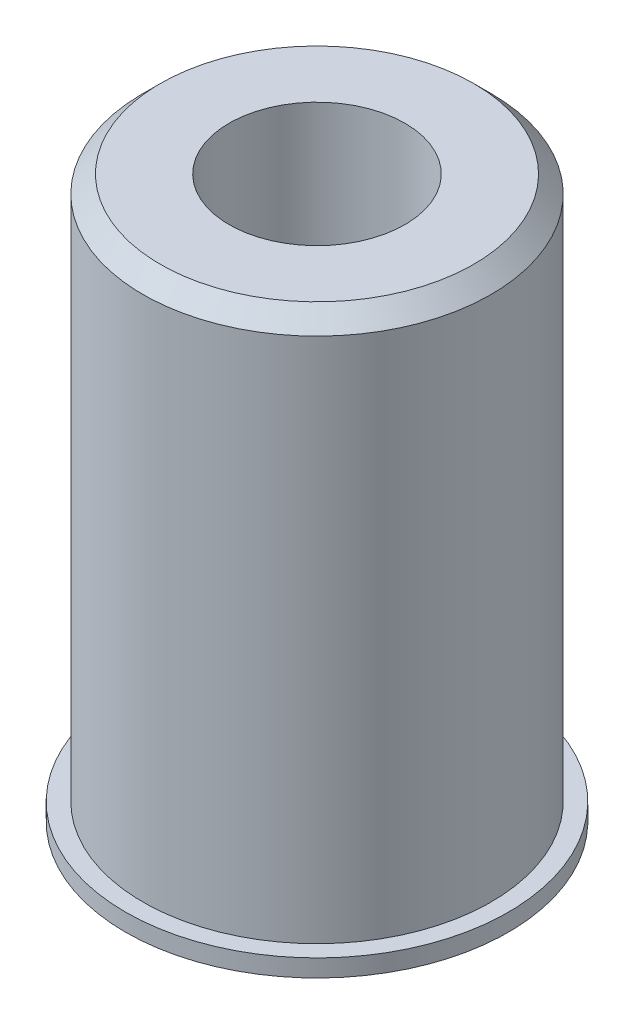
ISO-10303-21;
HEADER;
FILE_DESCRIPTION(('STEP AP214'),'2;1');
FILE_NAME('part.step','',(''),(''),'','','');
FILE_SCHEMA(('AUTOMOTIVE_DESIGN { 1 0 10303 214 1 1 1 1 }'));
ENDSEC;
DATA;
#1=APPLICATION_CONTEXT('core data for automotive mechanical design processes');
#2=APPLICATION_PROTOCOL_DEFINITION('international standard','automotive_design',2000,#1);
#3=PRODUCT_CONTEXT('',#1,'mechanical');
#4=PRODUCT('Part','Part','',(#3));
#5=PRODUCT_RELATED_PRODUCT_CATEGORY('part','',(#4));
#6=PRODUCT_DEFINITION_FORMATION('','',#4);
#7=PRODUCT_DEFINITION_CONTEXT('part definition',#1,'design');
#8=PRODUCT_DEFINITION('design','',#6,#7);
#9=PRODUCT_DEFINITION_SHAPE('','',#8);
#10=(LENGTH_UNIT() NAMED_UNIT(*) SI_UNIT(.MILLI.,.METRE.));
#11=(NAMED_UNIT(*) PLANE_ANGLE_UNIT() SI_UNIT($,.RADIAN.));
#12=(NAMED_UNIT(*) SI_UNIT($,.STERADIAN.) SOLID_ANGLE_UNIT());
#13=UNCERTAINTY_MEASURE_WITH_UNIT(LENGTH_MEASURE(1.E-05),#10,'distance_accuracy_value','');
#14=(GEOMETRIC_REPRESENTATION_CONTEXT(3) GLOBAL_UNCERTAINTY_ASSIGNED_CONTEXT((#13)) GLOBAL_UNIT_ASSIGNED_CONTEXT((#10,
#11,#12)) REPRESENTATION_CONTEXT('',''));
#15=CARTESIAN_POINT('',(0.,0.,0.));
#16=DIRECTION('',(0.,0.,1.));
#17=DIRECTION('',(1.,0.,0.));
#18=AXIS2_PLACEMENT_3D('',#15,#16,#17);
#19=CARTESIAN_POINT('',(0.,0.,0.));
#20=DIRECTION('',(0.,-1.,0.));
#21=DIRECTION('',(0.,0.,-1.));
#22=AXIS2_PLACEMENT_3D('',#19,#20,#21);
#23=CYLINDRICAL_SURFACE('',#22,10.);
#24=CARTESIAN_POINT('',(0.,0.,0.));
#25=DIRECTION('',(0.,-1.,0.));
#26=DIRECTION('',(0.,0.,-1.));
#27=AXIS2_PLACEMENT_3D('',#24,#25,#26);
#28=CIRCLE('',#27,10.);
#29=CARTESIAN_POINT('',(0.,0.,-10.));
#30=VERTEX_POINT('',#29);
#31=EDGE_CURVE('E82',#30,#30,#28,.T.);
#32=ORIENTED_EDGE('',*,*,#31,.F.);
#33=EDGE_LOOP('',(#32));
#34=FACE_BOUND('',#33,.T.);
#35=CARTESIAN_POINT('',(0.,30.225,0.));
#36=DIRECTION('',(0.,-1.,0.));
#37=DIRECTION('',(0.,0.,-1.));
#38=AXIS2_PLACEMENT_3D('',#35,#36,#37);
#39=CIRCLE('',#38,10.);
#40=CARTESIAN_POINT('',(0.,30.225,-10.));
#41=VERTEX_POINT('',#40);
#42=EDGE_CURVE('E10',#41,#41,#39,.T.);
#43=ORIENTED_EDGE('',*,*,#42,.T.);
#44=EDGE_LOOP('',(#43));
#45=FACE_BOUND('',#44,.T.);
#46=ADVANCED_FACE('F43',(#34,#45),#23,.T.);
#47=CARTESIAN_POINT('',(0.,31.225,0.));
#48=DIRECTION('',(0.,-1.,0.));
#49=DIRECTION('',(0.,0.,-1.));
#50=AXIS2_PLACEMENT_3D('',#47,#48,#49);
#51=CONICAL_SURFACE('',#50,9.,0.785398163397447);
#52=ORIENTED_EDGE('',*,*,#42,.F.);
#53=EDGE_LOOP('',(#52));
#54=FACE_BOUND('',#53,.T.);
#55=CARTESIAN_POINT('',(0.,31.225,0.));
#56=DIRECTION('',(0.,-1.,0.));
#57=DIRECTION('',(0.,0.,-1.));
#58=AXIS2_PLACEMENT_3D('',#55,#56,#57);
#59=CIRCLE('',#58,9.);
#60=CARTESIAN_POINT('',(0.,31.225,-9.));
#61=VERTEX_POINT('',#60);
#62=EDGE_CURVE('E50',#61,#61,#59,.T.);
#63=ORIENTED_EDGE('',*,*,#62,.T.);
#64=EDGE_LOOP('',(#63));
#65=FACE_BOUND('',#64,.T.);
#66=ADVANCED_FACE('F90',(#54,#65),#51,.T.);
#67=CARTESIAN_POINT('',(-5.05,31.225,0.));
#68=DIRECTION('',(0.,-1.,0.));
#69=DIRECTION('',(0.,0.,-1.));
#70=AXIS2_PLACEMENT_3D('',#67,#68,#69);
#71=PLANE('',#70);
#72=ORIENTED_EDGE('',*,*,#62,.F.);
#73=EDGE_LOOP('',(#72));
#74=FACE_BOUND('',#73,.T.);
#75=CARTESIAN_POINT('',(0.,31.225,0.));
#76=DIRECTION('',(0.,-1.,0.));
#77=DIRECTION('',(0.,0.,-1.));
#78=AXIS2_PLACEMENT_3D('',#75,#76,#77);
#79=CIRCLE('',#78,5.05);
#80=CARTESIAN_POINT('',(0.,31.225,-5.05));
#81=VERTEX_POINT('',#80);
#82=EDGE_CURVE('E55',#81,#81,#79,.T.);
#83=ORIENTED_EDGE('',*,*,#82,.T.);
#84=EDGE_LOOP('',(#83));
#85=FACE_BOUND('',#84,.T.);
#86=ADVANCED_FACE('F94',(#74,#85),#71,.F.);
#87=CARTESIAN_POINT('',(0.,0.,0.));
#88=DIRECTION('',(0.,-1.,0.));
#89=DIRECTION('',(0.,0.,-1.));
#90=AXIS2_PLACEMENT_3D('',#87,#88,#89);
#91=CYLINDRICAL_SURFACE('',#90,5.05);
#92=ORIENTED_EDGE('',*,*,#82,.F.);
#93=EDGE_LOOP('',(#92));
#94=FACE_BOUND('',#93,.T.);
#95=CARTESIAN_POINT('',(0.,23.725,0.));
#96=DIRECTION('',(0.,-1.,0.));
#97=DIRECTION('',(0.,0.,-1.));
#98=AXIS2_PLACEMENT_3D('',#95,#96,#97);
#99=CIRCLE('',#98,5.05);
#100=CARTESIAN_POINT('',(0.,23.725,-5.05));
#101=VERTEX_POINT('',#100);
#102=EDGE_CURVE('E60',#101,#101,#99,.T.);
#103=ORIENTED_EDGE('',*,*,#102,.T.);
#104=EDGE_LOOP('',(#103));
#105=FACE_BOUND('',#104,.T.);
#106=ADVANCED_FACE('F99',(#94,#105),#91,.F.);
#107=CARTESIAN_POINT('',(-8.25,23.725,0.));
#108=DIRECTION('',(0.,1.,0.));
#109=DIRECTION('',(0.,0.,1.));
#110=AXIS2_PLACEMENT_3D('',#107,#108,#109);
#111=PLANE('',#110);
#112=ORIENTED_EDGE('',*,*,#102,.F.);
#113=EDGE_LOOP('',(#112));
#114=FACE_BOUND('',#113,.T.);
#115=CARTESIAN_POINT('',(0.,23.725,0.));
#116=DIRECTION('',(0.,-1.,0.));
#117=DIRECTION('',(0.,0.,-1.));
#118=AXIS2_PLACEMENT_3D('',#115,#116,#117);
#119=CIRCLE('',#118,8.25);
#120=CARTESIAN_POINT('',(0.,23.725,-8.25));
#121=VERTEX_POINT('',#120);
#122=EDGE_CURVE('E66',#121,#121,#119,.T.);
#123=ORIENTED_EDGE('',*,*,#122,.T.);
#124=EDGE_LOOP('',(#123));
#125=FACE_BOUND('',#124,.T.);
#126=ADVANCED_FACE('F105',(#114,#125),#111,.F.);
#127=CARTESIAN_POINT('',(0.,0.,0.));
#128=DIRECTION('',(0.,-1.,0.));
#129=DIRECTION('',(0.,0.,-1.));
#130=AXIS2_PLACEMENT_3D('',#127,#128,#129);
#131=CYLINDRICAL_SURFACE('',#130,8.25);
#132=ORIENTED_EDGE('',*,*,#122,.F.);
#133=EDGE_LOOP('',(#132));
#134=FACE_BOUND('',#133,.T.);
#135=CARTESIAN_POINT('',(0.,-1.,0.));
#136=DIRECTION('',(0.,-1.,0.));
#137=DIRECTION('',(0.,0.,-1.));
#138=AXIS2_PLACEMENT_3D('',#135,#136,#137);
#139=CIRCLE('',#138,8.25);
#140=CARTESIAN_POINT('',(0.,-1.,-8.25));
#141=VERTEX_POINT('',#140);
#142=EDGE_CURVE('E70',#141,#141,#139,.T.);
#143=ORIENTED_EDGE('',*,*,#142,.T.);
#144=EDGE_LOOP('',(#143));
#145=FACE_BOUND('',#144,.T.);
#146=ADVANCED_FACE('F109',(#134,#145),#131,.F.);
#147=CARTESIAN_POINT('',(-11.,-1.,0.));
#148=DIRECTION('',(0.,1.,0.));
#149=DIRECTION('',(0.,0.,1.));
#150=AXIS2_PLACEMENT_3D('',#147,#148,#149);
#151=PLANE('',#150);
#152=ORIENTED_EDGE('',*,*,#142,.F.);
#153=EDGE_LOOP('',(#152));
#154=FACE_BOUND('',#153,.T.);
#155=CARTESIAN_POINT('',(0.,-1.,0.));
#156=DIRECTION('',(0.,-1.,0.));
#157=DIRECTION('',(0.,0.,-1.));
#158=AXIS2_PLACEMENT_3D('',#155,#156,#157);
#159=CIRCLE('',#158,11.);
#160=CARTESIAN_POINT('',(0.,-1.,-11.));
#161=VERTEX_POINT('',#160);
#162=EDGE_CURVE('E74',#161,#161,#159,.T.);
#163=ORIENTED_EDGE('',*,*,#162,.T.);
#164=EDGE_LOOP('',(#163));
#165=FACE_BOUND('',#164,.T.);
#166=ADVANCED_FACE('F113',(#154,#165),#151,.F.);
#167=CARTESIAN_POINT('',(0.,0.,0.));
#168=DIRECTION('',(0.,-1.,0.));
#169=DIRECTION('',(0.,0.,-1.));
#170=AXIS2_PLACEMENT_3D('',#167,#168,#169);
#171=CYLINDRICAL_SURFACE('',#170,11.);
#172=ORIENTED_EDGE('',*,*,#162,.F.);
#173=EDGE_LOOP('',(#172));
#174=FACE_BOUND('',#173,.T.);
#175=CARTESIAN_POINT('',(0.,0.,0.));
#176=DIRECTION('',(0.,-1.,0.));
#177=DIRECTION('',(0.,0.,-1.));
#178=AXIS2_PLACEMENT_3D('',#175,#176,#177);
#179=CIRCLE('',#178,11.);
#180=CARTESIAN_POINT('',(0.,0.,-11.));
#181=VERTEX_POINT('',#180);
#182=EDGE_CURVE('E78',#181,#181,#179,.T.);
#183=ORIENTED_EDGE('',*,*,#182,.T.);
#184=EDGE_LOOP('',(#183));
#185=FACE_BOUND('',#184,.T.);
#186=ADVANCED_FACE('F117',(#174,#185),#171,.T.);
#187=CARTESIAN_POINT('',(-10.,0.,0.));
#188=DIRECTION('',(0.,-1.,0.));
#189=DIRECTION('',(0.,0.,-1.));
#190=AXIS2_PLACEMENT_3D('',#187,#188,#189);
#191=PLANE('',#190);
#192=ORIENTED_EDGE('',*,*,#182,.F.);
#193=EDGE_LOOP('',(#192));
#194=FACE_BOUND('',#193,.T.);
#195=ORIENTED_EDGE('',*,*,#31,.T.);
#196=EDGE_LOOP('',(#195));
#197=FACE_BOUND('',#196,.T.);
#198=ADVANCED_FACE('F87',(#194,#197),#191,.F.);
#199=CLOSED_SHELL('',(#46,#66,#86,#106,#126,#146,#166,#186,#198));
#200=MANIFOLD_SOLID_BREP('B2',#199);
#201=ADVANCED_BREP_SHAPE_REPRESENTATION('',(#18,#200),#14);
#202=SHAPE_DEFINITION_REPRESENTATION(#9,#201);
ENDSEC;
END-ISO-10303-21;
